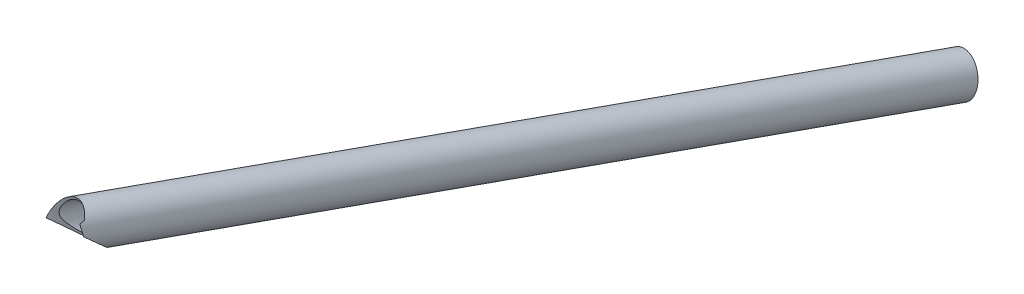
ISO-10303-21;
HEADER;
FILE_DESCRIPTION(('STEP AP214'),'2;1');
FILE_NAME('part.step','',(''),(''),'','','');
FILE_SCHEMA(('AUTOMOTIVE_DESIGN { 1 0 10303 214 1 1 1 1 }'));
ENDSEC;
DATA;
#1=APPLICATION_CONTEXT('core data for automotive mechanical design processes');
#2=APPLICATION_PROTOCOL_DEFINITION('international standard','automotive_design',2000,#1);
#3=PRODUCT_CONTEXT('',#1,'mechanical');
#4=PRODUCT('Part','Part','',(#3));
#5=PRODUCT_RELATED_PRODUCT_CATEGORY('part','',(#4));
#6=PRODUCT_DEFINITION_FORMATION('','',#4);
#7=PRODUCT_DEFINITION_CONTEXT('part definition',#1,'design');
#8=PRODUCT_DEFINITION('design','',#6,#7);
#9=PRODUCT_DEFINITION_SHAPE('','',#8);
#10=(LENGTH_UNIT() NAMED_UNIT(*) SI_UNIT(.MILLI.,.METRE.));
#11=(NAMED_UNIT(*) PLANE_ANGLE_UNIT() SI_UNIT($,.RADIAN.));
#12=(NAMED_UNIT(*) SI_UNIT($,.STERADIAN.) SOLID_ANGLE_UNIT());
#13=UNCERTAINTY_MEASURE_WITH_UNIT(LENGTH_MEASURE(1.E-05),#10,'distance_accuracy_value','');
#14=(GEOMETRIC_REPRESENTATION_CONTEXT(3) GLOBAL_UNCERTAINTY_ASSIGNED_CONTEXT((#13)) GLOBAL_UNIT_ASSIGNED_CONTEXT((#10,
#11,#12)) REPRESENTATION_CONTEXT('',''));
#15=CARTESIAN_POINT('',(0.,0.,0.));
#16=DIRECTION('',(0.,0.,1.));
#17=DIRECTION('',(1.,0.,0.));
#18=AXIS2_PLACEMENT_3D('',#15,#16,#17);
#19=CARTESIAN_POINT('',(-325.,320.000000000001,-1580.));
#20=DIRECTION('',(0.171152156864514,-0.228202875819352,-0.958452078441276));
#21=DIRECTION('',(0.,0.972806214685367,-0.23162052730604));
#22=AXIS2_PLACEMENT_3D('',#19,#20,#21);
#23=CYLINDRICAL_SURFACE('',#22,9.79999999999998);
#24=CARTESIAN_POINT('',(-250.,220.,-2000.));
#25=DIRECTION('',(-0.171152156864514,0.228202875819352,0.958452078441277));
#26=DIRECTION('',(-0.166932001795752,-0.965457944067909,0.200061653028832));
#27=AXIS2_PLACEMENT_3D('',#24,#25,#26);
#28=CIRCLE('',#27,9.79999999999998);
#29=CARTESIAN_POINT('',(-251.635933617598,210.538512148135,-1998.03939580032));
#30=VERTEX_POINT('',#29);
#31=EDGE_CURVE('E85',#30,#30,#28,.T.);
#32=ORIENTED_EDGE('',*,*,#31,.F.);
#33=EDGE_LOOP('',(#32));
#34=FACE_BOUND('',#33,.T.);
#35=CARTESIAN_POINT('',(-323.883441923824,328.044756802349,-1588.52260639419));
#36=CARTESIAN_POINT('',(-324.136487424916,328.031201247985,-1588.5795391723));
#37=CARTESIAN_POINT('',(-324.390409071568,328.008496905392,-1588.63041961915));
#38=CARTESIAN_POINT('',(-324.898284051821,327.944902518218,-1588.71956619623));
#39=CARTESIAN_POINT('',(-325.152237365107,327.904006074404,-1588.75782787943));
#40=CARTESIAN_POINT('',(-325.658589000445,327.804245335822,-1588.82143933747));
#41=CARTESIAN_POINT('',(-325.910984738547,327.74535668479,-1588.84677148453));
#42=CARTESIAN_POINT('',(-326.412007953383,327.610085815984,-1588.88434265663));
#43=CARTESIAN_POINT('',(-326.660635757793,327.533705128809,-1588.89658282674));
#44=CARTESIAN_POINT('',(-327.15198711971,327.364168753427,-1588.90808346139));
#45=CARTESIAN_POINT('',(-327.394718989368,327.27103844967,-1588.90736340609));
#46=CARTESIAN_POINT('',(-327.872977560984,327.068632735063,-1588.89332264943));
#47=CARTESIAN_POINT('',(-328.108504115194,326.959356993412,-1588.88000168987));
#48=CARTESIAN_POINT('',(-328.570661566778,326.72550908499,-1588.84130566927));
#49=CARTESIAN_POINT('',(-328.797296576491,326.600944102225,-1588.81593625353));
#50=CARTESIAN_POINT('',(-329.24034372592,326.337313640095,-1588.753881074));
#51=CARTESIAN_POINT('',(-329.456755746773,326.198247992192,-1588.71719517866));
#52=CARTESIAN_POINT('',(-329.882853776664,325.90312491773,-1588.63247874897));
#53=CARTESIAN_POINT('',(-330.09227355424,325.746752127553,-1588.58420840697));
#54=CARTESIAN_POINT('',(-330.497772441567,325.420573490696,-1588.47800758243));
#55=CARTESIAN_POINT('',(-330.6938511729,325.250767263272,-1588.42007682603));
#56=CARTESIAN_POINT('',(-331.071803312876,324.898211505746,-1588.29590245971));
#57=CARTESIAN_POINT('',(-331.25365312381,324.715441394271,-1588.22964549641));
#58=CARTESIAN_POINT('',(-331.60167809506,324.337857418278,-1588.09064114584));
#59=CARTESIAN_POINT('',(-331.767853441172,324.143043696564,-1588.01789383551));
#60=CARTESIAN_POINT('',(-332.094330709366,323.727991591758,-1587.86284974309));
#61=CARTESIAN_POINT('',(-332.253435597495,323.506926445993,-1587.78024040772));
#62=CARTESIAN_POINT('',(-332.551084227081,323.051829557808,-1587.61325372774));
#63=CARTESIAN_POINT('',(-332.689620238547,322.817792985742,-1587.52887573197));
#64=CARTESIAN_POINT('',(-332.944091817133,322.337478767063,-1587.3628593851));
#65=CARTESIAN_POINT('',(-333.060075523119,322.091228633975,-1587.28121551346));
#66=CARTESIAN_POINT('',(-333.267650840882,321.586210845975,-1587.12626610256));
#67=CARTESIAN_POINT('',(-333.359265930934,321.327455525543,-1587.05295257661));
#68=CARTESIAN_POINT('',(-333.480236909948,320.917873893446,-1586.95193891518));
#69=CARTESIAN_POINT('',(-333.519008012329,320.771181158797,-1586.91860842906));
#70=CARTESIAN_POINT('',(-333.588046824918,320.474544934014,-1586.85830864623));
#71=CARTESIAN_POINT('',(-333.618317857304,320.324602738655,-1586.83133686495));
#72=CARTESIAN_POINT('',(-333.669889198443,320.022350107985,-1586.7854208945));
#73=CARTESIAN_POINT('',(-333.691212396145,319.870046761559,-1586.76645622203));
#74=CARTESIAN_POINT('',(-333.724706884294,319.563530912209,-1586.73803207016));
#75=CARTESIAN_POINT('',(-333.736878379721,319.409318452123,-1586.72857237788));
#76=CARTESIAN_POINT('',(-333.752068506453,319.09867507167,-1586.7204347538));
#77=CARTESIAN_POINT('',(-333.754999601595,318.94223695505,-1586.72185950145));
#78=CARTESIAN_POINT('',(-333.751713366108,318.630019523956,-1586.7365522151));
#79=CARTESIAN_POINT('',(-333.745496618836,318.474240168108,-1586.74981942588));
#80=CARTESIAN_POINT('',(-333.724509060171,318.164644152213,-1586.78831350264));
#81=CARTESIAN_POINT('',(-333.709731917313,318.010829031113,-1586.81354921828));
#82=CARTESIAN_POINT('',(-333.672491821484,317.706456726946,-1586.87537954769));
#83=CARTESIAN_POINT('',(-333.650027481677,317.55590013696,-1586.91197621095));
#84=CARTESIAN_POINT('',(-333.591285737306,317.21786349651,-1587.00694062745));
#85=CARTESIAN_POINT('',(-333.552907325622,317.031656306668,-1587.06852924151));
#86=CARTESIAN_POINT('',(-333.467263173205,316.666553307002,-1587.20555182981));
#87=CARTESIAN_POINT('',(-333.41999353364,316.48766074672,-1587.28099187762));
#88=CARTESIAN_POINT('',(-333.318063376991,316.136489972063,-1587.44316004395));
#89=CARTESIAN_POINT('',(-333.263376944922,315.964237798638,-1587.52992770058));
#90=CARTESIAN_POINT('',(-333.148024186392,315.626518447809,-1587.71207394946));
#91=CARTESIAN_POINT('',(-333.087358665352,315.461050360785,-1587.80745138179));
#92=CARTESIAN_POINT('',(-332.935638354041,315.071079666909,-1588.04437958839));
#93=CARTESIAN_POINT('',(-332.842143774373,314.849476263317,-1588.18912364404));
#94=CARTESIAN_POINT('',(-332.646799640272,314.416174372458,-1588.48761862304));
#95=CARTESIAN_POINT('',(-332.544945821177,314.204481028616,-1588.64137413222));
#96=CARTESIAN_POINT('',(-332.33363801113,313.78915998528,-1588.9553073224));
#97=CARTESIAN_POINT('',(-332.224170433833,313.585547778255,-1589.11549625656));
#98=CARTESIAN_POINT('',(-331.998330787598,313.185642740891,-1589.43996114847));
#99=CARTESIAN_POINT('',(-331.88195999917,312.989348564027,-1589.60423634499));
#100=CARTESIAN_POINT('',(-331.641678918508,312.601784671402,-1589.93658053047));
#101=CARTESIAN_POINT('',(-331.517720798063,312.410560742379,-1590.10466821485));
#102=CARTESIAN_POINT('',(-331.263080366848,312.033972356369,-1590.44231616443));
#103=CARTESIAN_POINT('',(-331.132397804861,311.848608118713,-1590.61187648445));
#104=CARTESIAN_POINT('',(-330.864396960838,311.483544854982,-1590.95131445225));
#105=CARTESIAN_POINT('',(-330.727086355483,311.303839655244,-1591.12119152378));
#106=CARTESIAN_POINT('',(-330.445527313685,310.949649590846,-1591.46063809147));
#107=CARTESIAN_POINT('',(-330.301278881109,310.775164723277,-1591.6302075878));
#108=CARTESIAN_POINT('',(-329.994441466824,310.418373440365,-1591.98105324711));
#109=CARTESIAN_POINT('',(-329.831289772501,310.236469738616,-1592.16224770017));
#110=CARTESIAN_POINT('',(-329.496260357833,309.878704980509,-1592.5225472622));
#111=CARTESIAN_POINT('',(-329.324382415385,309.702844078147,-1592.70165231784));
#112=CARTESIAN_POINT('',(-328.97117064182,309.357236113556,-1593.05708663549));
#113=CARTESIAN_POINT('',(-328.789825170164,309.187497033232,-1593.23341211601));
#114=CARTESIAN_POINT('',(-328.41726923453,308.854862413558,-1593.58205702632));
#115=CARTESIAN_POINT('',(-328.226059197368,308.691966578668,-1593.75437662897));
#116=CARTESIAN_POINT('',(-327.835065733601,308.375373738525,-1594.09213163101));
#117=CARTESIAN_POINT('',(-327.635390717592,308.221599351425,-1594.25761960807));
#118=CARTESIAN_POINT('',(-327.224818113346,307.922412509549,-1594.58226957127));
#119=CARTESIAN_POINT('',(-327.013918585252,307.777001509255,-1594.74143045559));
#120=CARTESIAN_POINT('',(-326.58051044786,307.49622029538,-1595.05140986329));
#121=CARTESIAN_POINT('',(-326.358028094369,307.360828924686,-1595.20224578349));
#122=CARTESIAN_POINT('',(-325.900182622219,307.101585222075,-1595.49380900593));
#123=CARTESIAN_POINT('',(-325.664826853047,306.9777264131,-1595.63454197203));
#124=CARTESIAN_POINT('',(-325.278220302075,306.791172859995,-1595.84893028793));
#125=CARTESIAN_POINT('',(-325.131412208969,306.723986242878,-1595.9267119234));
#126=CARTESIAN_POINT('',(-324.832731935688,306.595197426143,-1596.07702574252));
#127=CARTESIAN_POINT('',(-324.680859906486,306.533595060243,-1596.14955808248));
#128=CARTESIAN_POINT('',(-324.371733071131,306.416646764159,-1596.28864047686));
#129=CARTESIAN_POINT('',(-324.214471322676,306.361309330899,-1596.35518238221));
#130=CARTESIAN_POINT('',(-323.894862027018,306.257887908045,-1596.48117743639));
#131=CARTESIAN_POINT('',(-323.732514389411,306.209804047476,-1596.54063045914));
#132=CARTESIAN_POINT('',(-323.234170243063,306.076951955321,-1596.7079499114));
#133=CARTESIAN_POINT('',(-322.890048434172,306.004827215257,-1596.80330143566));
#134=CARTESIAN_POINT('',(-322.362829174377,305.929270634161,-1596.91301220119));
#135=CARTESIAN_POINT('',(-322.185352390326,305.909525468315,-1596.94402165143));
#136=CARTESIAN_POINT('',(-321.827711643184,305.882048329118,-1596.99364153208));
#137=CARTESIAN_POINT('',(-321.647548704172,305.874311890068,-1597.01225657014));
#138=CARTESIAN_POINT('',(-321.329705327978,305.872169648059,-1597.03303475538));
#139=CARTESIAN_POINT('',(-321.192222498519,305.875006615074,-1597.03807686116));
#140=CARTESIAN_POINT('',(-320.917593176163,305.888513429916,-1597.03991702142));
#141=CARTESIAN_POINT('',(-320.78044661922,305.899181647361,-1597.03671679152));
#142=CARTESIAN_POINT('',(-320.507536106171,305.928501559483,-1597.0218445481));
#143=CARTESIAN_POINT('',(-320.371771506445,305.94714934562,-1597.01017668025));
#144=CARTESIAN_POINT('',(-320.102575749074,305.99239355235,-1596.97834653674));
#145=CARTESIAN_POINT('',(-319.969144668132,306.018990233704,-1596.95818398241));
#146=CARTESIAN_POINT('',(-319.705712451002,306.079875398939,-1596.90957159761));
#147=CARTESIAN_POINT('',(-319.575708578318,306.114157524748,-1596.88112861167));
#148=CARTESIAN_POINT('',(-319.319833924915,306.19003113557,-1596.81632230374));
#149=CARTESIAN_POINT('',(-319.193964596852,306.231625157669,-1596.77995623153));
#150=CARTESIAN_POINT('',(-318.947040730668,306.321592943407,-1596.69983088423));
#151=CARTESIAN_POINT('',(-318.825988322931,306.369969664979,-1596.65606838183));
#152=CARTESIAN_POINT('',(-318.589229961654,306.472870134116,-1596.5617978415));
#153=CARTESIAN_POINT('',(-318.473525336614,306.527395397658,-1596.51128813941));
#154=CARTESIAN_POINT('',(-318.207700076052,306.662275454472,-1596.38519680641));
#155=CARTESIAN_POINT('',(-318.059939855942,306.744929149551,-1596.30707931771));
#156=CARTESIAN_POINT('',(-317.775097837794,306.918717809731,-1596.14143104499));
#157=CARTESIAN_POINT('',(-317.638020454229,307.009856247203,-1596.05389640471));
#158=CARTESIAN_POINT('',(-317.242216879117,307.294086248464,-1595.7792839629));
#159=CARTESIAN_POINT('',(-316.99922843367,307.49782958574,-1595.58035083259));
#160=CARTESIAN_POINT('',(-316.594192642882,307.883745697752,-1595.20120981155));
#161=CARTESIAN_POINT('',(-316.42552639497,308.062721591716,-1595.02456466439));
#162=CARTESIAN_POINT('',(-316.110532640076,308.430009530018,-1594.66107544261));
#163=CARTESIAN_POINT('',(-315.964220076009,308.618327709018,-1594.47422465804));
#164=CARTESIAN_POINT('',(-315.691278930516,309.002212733694,-1594.09289822384));
#165=CARTESIAN_POINT('',(-315.564692321897,309.197793968289,-1593.89840738897));
#166=CARTESIAN_POINT('',(-315.329226113652,309.594315830594,-1593.50414095961));
#167=CARTESIAN_POINT('',(-315.220353296957,309.795258477165,-1593.30436337462));
#168=CARTESIAN_POINT('',(-315.022847766759,310.192472096435,-1592.9099305793));
#169=CARTESIAN_POINT('',(-314.933539932343,310.388565229802,-1592.71543136278));
#170=CARTESIAN_POINT('',(-314.768011811684,310.783885168073,-1592.32415625387));
#171=CARTESIAN_POINT('',(-314.691789638934,310.983111516746,-1592.12738069402));
#172=CARTESIAN_POINT('',(-314.551172460129,311.384472817302,-1591.73219231344));
#173=CARTESIAN_POINT('',(-314.486788866264,311.586610375276,-1591.53377810357));
#174=CARTESIAN_POINT('',(-314.368957264471,311.99333848937,-1591.13622375696));
#175=CARTESIAN_POINT('',(-314.315509567338,312.19792911503,-1590.93708359976));
#176=CARTESIAN_POINT('',(-314.218737481162,312.609448832867,-1590.53871623161));
#177=CARTESIAN_POINT('',(-314.175414438738,312.816378232277,-1590.3394890126));
#178=CARTESIAN_POINT('',(-314.09824011703,313.232539876621,-1589.94160385481));
#179=CARTESIAN_POINT('',(-314.064389080565,313.441772180447,-1589.74294593075));
#180=CARTESIAN_POINT('',(-314.005649535105,313.86251913516,-1589.34696895189));
#181=CARTESIAN_POINT('',(-313.980756014832,314.074032441507,-1589.14964920926));
#182=CARTESIAN_POINT('',(-313.939503832591,314.499668941221,-1588.75696689966));
#183=CARTESIAN_POINT('',(-313.923144728796,314.713791998894,-1588.5616042319));
#184=CARTESIAN_POINT('',(-313.897600137832,315.164019562962,-1588.1565717768));
#185=CARTESIAN_POINT('',(-313.889173798568,315.400398414502,-1587.94715821977));
#186=CARTESIAN_POINT('',(-313.881907141474,315.87736873625,-1587.53298642975));
#187=CARTESIAN_POINT('',(-313.883067062342,316.117960311204,-1587.32822831282));
#188=CARTESIAN_POINT('',(-313.895015620176,316.604407254886,-1586.92512296859));
#189=CARTESIAN_POINT('',(-313.905808108097,316.850264690454,-1586.72677833817));
#190=CARTESIAN_POINT('',(-313.937353342754,317.348424292278,-1586.33917391053));
#191=CARTESIAN_POINT('',(-313.958104340222,317.600725319317,-1586.14991252422));
#192=CARTESIAN_POINT('',(-314.004102356253,318.052410715809,-1585.82782097265));
#193=CARTESIAN_POINT('',(-314.027101675577,318.250087499467,-1585.69228591625));
#194=CARTESIAN_POINT('',(-314.079896887834,318.651108298088,-1585.43107135156));
#195=CARTESIAN_POINT('',(-314.109694471414,318.854453711711,-1585.30539430532));
#196=CARTESIAN_POINT('',(-314.176819348103,319.267057312659,-1585.06752281621));
#197=CARTESIAN_POINT('',(-314.214127206358,319.476299063661,-1584.9552947425));
#198=CARTESIAN_POINT('',(-314.297435739794,319.901614729847,-1584.74837330788));
#199=CARTESIAN_POINT('',(-314.343429634221,320.117683206914,-1584.6536663825));
#200=CARTESIAN_POINT('',(-314.426264776814,320.473559296172,-1584.51852129223));
#201=CARTESIAN_POINT('',(-314.460025361644,320.611427531282,-1584.47108047702));
#202=CARTESIAN_POINT('',(-314.531815016291,320.889170397782,-1584.38647555235));
#203=CARTESIAN_POINT('',(-314.569842386544,321.029044211075,-1584.34930737134));
#204=CARTESIAN_POINT('',(-314.650409014694,321.309779904004,-1584.28654386206));
#205=CARTESIAN_POINT('',(-314.692938682162,321.450639109459,-1584.26092452238));
#206=CARTESIAN_POINT('',(-314.782812595821,321.732541804519,-1584.22203725142));
#207=CARTESIAN_POINT('',(-314.830156680216,321.873585287774,-1584.20876890523));
#208=CARTESIAN_POINT('',(-314.929988545159,322.155130282317,-1584.19488364295));
#209=CARTESIAN_POINT('',(-314.982496711354,322.295627167535,-1584.19431906861));
#210=CARTESIAN_POINT('',(-315.09249601049,322.574137188472,-1584.20563424331));
#211=CARTESIAN_POINT('',(-315.149987251851,322.712150270072,-1584.21751426317));
#212=CARTESIAN_POINT('',(-315.269990018283,322.98479107685,-1584.25280986919));
#213=CARTESIAN_POINT('',(-315.332511667399,323.119411220834,-1584.2762492312));
#214=CARTESIAN_POINT('',(-315.462354189849,323.384115750995,-1584.33332236305));
#215=CARTESIAN_POINT('',(-315.529676663387,323.51419860309,-1584.36695954429));
#216=CARTESIAN_POINT('',(-315.694434356957,323.815825713313,-1584.4567752792));
#217=CARTESIAN_POINT('',(-315.793885503184,323.985155704127,-1584.51669946264));
#218=CARTESIAN_POINT('',(-316.001176805577,324.313541290125,-1584.64887815872));
#219=CARTESIAN_POINT('',(-316.109020411091,324.472592611033,-1584.72113775601));
#220=CARTESIAN_POINT('',(-316.333088437595,324.780571315416,-1584.87479655426));
#221=CARTESIAN_POINT('',(-316.449330223532,324.929476409097,-1584.95621489818));
#222=CARTESIAN_POINT('',(-316.689797459588,325.216867912723,-1585.12529944824));
#223=CARTESIAN_POINT('',(-316.814022855042,325.355354393991,-1585.21296561159));
#224=CARTESIAN_POINT('',(-317.117864083785,325.671564112156,-1585.42558290562));
#225=CARTESIAN_POINT('',(-317.300936488655,325.844791794829,-1585.55230424583));
#226=CARTESIAN_POINT('',(-317.681396544999,326.172284871511,-1585.80879479392));
#227=CARTESIAN_POINT('',(-317.87878854916,326.326544461121,-1585.93856492037));
#228=CARTESIAN_POINT('',(-318.287319221113,326.616118893955,-1586.19768881414));
#229=CARTESIAN_POINT('',(-318.498459752829,326.751431160577,-1586.3270425225));
#230=CARTESIAN_POINT('',(-318.933694096002,327.002870198641,-1586.58248846375));
#231=CARTESIAN_POINT('',(-319.157786269065,327.118999389622,-1586.70858110627));
#232=CARTESIAN_POINT('',(-319.619682105425,327.332500596287,-1586.95606087085));
#233=CARTESIAN_POINT('',(-319.857573455318,327.429730406763,-1587.07740721445));
#234=CARTESIAN_POINT('',(-320.344413851322,327.603908137228,-1587.31234651757));
#235=CARTESIAN_POINT('',(-320.593364379901,327.68085332845,-1587.42593843241));
#236=CARTESIAN_POINT('',(-321.10032804855,327.813796976985,-1587.6432920115));
#237=CARTESIAN_POINT('',(-321.358321378931,327.869838430314,-1587.74707352221));
#238=CARTESIAN_POINT('',(-321.882070348571,327.960708594615,-1587.94342691721));
#239=CARTESIAN_POINT('',(-322.147822248412,327.995547353433,-1588.03600409449));
#240=CARTESIAN_POINT('',(-322.657244917225,328.041178862098,-1588.19961950513));
#241=CARTESIAN_POINT('',(-322.900329457717,328.054099767553,-1588.27189703739));
#242=CARTESIAN_POINT('',(-323.389810928438,328.062511872007,-1588.40557853499));
#243=CARTESIAN_POINT('',(-323.636208245137,328.058001019525,-1588.46698121962));
#244=CARTESIAN_POINT('',(-323.883441923824,328.044756802349,-1588.52260639419));
#245=B_SPLINE_CURVE_WITH_KNOTS('',3,(#35,#36,#37,#38,#39,#40,#41,#42,#43,#44,#45,#46,#47,#48,
#49,#50,#51,#52,#53,#54,#55,#56,#57,#58,#59,#60,#61,#62,#63,#64,#65,#66,#67,#68,#69,#70,#71,#72,
#73,#74,#75,#76,#77,#78,#79,#80,#81,#82,#83,#84,#85,#86,#87,#88,#89,#90,#91,#92,#93,#94,#95,#96,
#97,#98,#99,#100,#101,#102,#103,#104,#105,#106,#107,#108,#109,#110,#111,#112,#113,#114,#115,
#116,#117,#118,#119,#120,#121,#122,#123,#124,#125,#126,#127,#128,#129,#130,#131,#132,#133,#134,
#135,#136,#137,#138,#139,#140,#141,#142,#143,#144,#145,#146,#147,#148,#149,#150,#151,#152,#153,
#154,#155,#156,#157,#158,#159,#160,#161,#162,#163,#164,#165,#166,#167,#168,#169,#170,#171,#172,
#173,#174,#175,#176,#177,#178,#179,#180,#181,#182,#183,#184,#185,#186,#187,#188,#189,#190,#191,
#192,#193,#194,#195,#196,#197,#198,#199,#200,#201,#202,#203,#204,#205,#206,#207,#208,#209,#210,
#211,#212,#213,#214,#215,#216,#217,#218,#219,#220,#221,#222,#223,#224,#225,#226,#227,#228,#229,
#230,#231,#232,#233,#234,#235,#236,#237,#238,#239,#240,#241,#242,#243,#244),.UNSPECIFIED.,.T.,
.F.,(4,2,2,2,2,2,2,2,2,2,2,2,2,2,2,2,2,2,2,2,2,2,2,2,2,2,2,2,2,2,2,2,2,2,2,2,2,2,2,2,2,2,2,2,2,
2,2,2,2,2,2,2,2,2,2,2,2,2,2,2,2,2,2,2,2,2,2,2,2,2,2,2,2,2,2,2,2,2,2,2,2,2,2,2,2,2,2,2,2,2,2,2,2,
2,2,2,2,2,2,2,2,2,2,2,4),(0.,0.778946805111406,1.55816782861835,2.33844840201982,
3.11866072495122,3.89770043103775,4.67675610090994,5.4554471047065,6.23414716016954,
7.03061934551481,7.82711411336219,8.62490298607427,9.4226824010494,10.2755254011069,
11.1286881012398,11.9800092006901,12.8305070875934,13.2962241875336,13.7617590119171,
14.2260956094426,14.6904218063914,15.1591336417943,15.627815588735,16.0968446268755,
16.5659583264198,17.1644959601618,17.7632966690693,18.3642463040277,18.9651150976007,
19.8066433352127,20.6486035993572,21.4921068793532,22.3354541800632,23.1848127514056,
24.0342030769317,24.8826321883742,25.7310608269436,26.6434831828897,27.555928773702,
28.4695239442306,29.3830796188461,30.2872388727134,31.1915548969378,32.0939034295695,
32.9957420781205,33.5331760518223,34.07059401707,34.6087323473417,35.1468802487622,
36.2342464892614,36.7773221592636,37.3201958266291,37.7325823977015,38.1448831385463,
38.556982157585,38.9690946969423,39.380867550723,39.7927835646433,40.2048797769466,
40.6170778182618,41.1755752768811,41.7343023131679,42.8528870189403,43.7601439463247,
44.6680047249023,45.5777716177143,46.4878860609878,47.3583520844786,48.2286925107346,
49.0998675815219,49.971067407305,50.8423830402311,51.7137210077676,52.5845707451495,
53.4553753940001,54.4029134579182,55.3504751154539,56.2984157636028,57.2461899617853,
57.9682471060479,58.6904840133979,59.4108754243826,60.1307067692035,60.5793268779329,
61.0277689207181,61.475274250046,61.9227645453578,62.3720982425744,62.821441718654,
63.2717133065592,63.7221356863426,64.3371085514619,64.9523355225366,65.5688731666658,
66.1854065897363,67.0305862666594,67.8760239355818,68.7215764622045,69.5670222587567,
70.4186021549954,71.2702965507731,72.1202293437619,72.9697590437539,73.7307258303123,
74.4917821751112),.UNSPECIFIED.);
#246=CARTESIAN_POINT('',(-323.883441923824,328.044756802349,-1588.52260639419));
#247=VERTEX_POINT('',#246);
#248=EDGE_CURVE('E92',#247,#247,#245,.T.);
#249=ORIENTED_EDGE('',*,*,#248,.T.);
#250=EDGE_LOOP('',(#249));
#251=FACE_BOUND('',#250,.T.);
#252=ADVANCED_FACE('F41',(#34,#251),#23,.F.);
#253=CARTESIAN_POINT('',(-325.,320.000000000001,-1580.));
#254=DIRECTION('',(0.171152156864514,-0.228202875819352,-0.958452078441276));
#255=DIRECTION('',(0.,0.972806214685367,-0.23162052730604));
#256=AXIS2_PLACEMENT_3D('',#253,#254,#255);
#257=CYLINDRICAL_SURFACE('',#256,11.);
#258=CARTESIAN_POINT('',(-250.,220.,-2000.));
#259=DIRECTION('',(-0.171152156864514,0.228202875819352,0.958452078441277));
#260=DIRECTION('',(-0.166932001795752,-0.965457944067909,0.200061653028832));
#261=AXIS2_PLACEMENT_3D('',#258,#259,#260);
#262=CIRCLE('',#261,11.);
#263=CARTESIAN_POINT('',(-251.836252019753,209.379962615253,-1997.79932181668));
#264=VERTEX_POINT('',#263);
#265=EDGE_CURVE('E87',#264,#264,#262,.T.);
#266=ORIENTED_EDGE('',*,*,#265,.T.);
#267=EDGE_LOOP('',(#266));
#268=FACE_BOUND('',#267,.T.);
#269=CARTESIAN_POINT('',(-325.,320.,-1580.));
#270=DIRECTION('',(0.526991553913357,-0.846050959333568,-0.0804840127897105));
#271=DIRECTION('',(-0.020132316108703,0.0822472927426935,-0.996408587219418));
#272=AXIS2_PLACEMENT_3D('',#269,#270,#271);
#273=ELLIPSE('',#272,30.5210436776293,11.);
#274=CARTESIAN_POINT('',(-315.659557692804,325.81486052971,-1579.96687694731));
#275=VERTEX_POINT('',#274);
#276=CARTESIAN_POINT('',(-315.751220700313,326.001625780896,-1582.53034941331));
#277=VERTEX_POINT('',#276);
#278=EDGE_CURVE('E70',#275,#277,#273,.F.);
#279=ORIENTED_EDGE('',*,*,#278,.F.);
#280=CARTESIAN_POINT('',(-325.,320.000000000001,-1580.));
#281=DIRECTION('',(-0.0427126536783039,0.0629297921225689,0.997103540500768));
#282=DIRECTION('',(0.611440895819701,-0.787641342485716,0.0759022168747455));
#283=AXIS2_PLACEMENT_3D('',#280,#281,#282);
#284=ELLIPSE('',#283,11.2549576190536,11.);
#285=CARTESIAN_POINT('',(-314.891903689015,324.374891386588,-1579.84311297151));
#286=VERTEX_POINT('',#285);
#287=EDGE_CURVE('E46',#286,#275,#284,.T.);
#288=ORIENTED_EDGE('',*,*,#287,.F.);
#289=CARTESIAN_POINT('',(-325.,320.,-1580.));
#290=DIRECTION('',(-0.020132316108703,0.0822472927426935,-0.996408587219418));
#291=DIRECTION('',(0.526991553913357,-0.846050959333568,-0.0804840127897105));
#292=AXIS2_PLACEMENT_3D('',#289,#290,#291);
#293=ELLIPSE('',#292,11.7925144812184,11.);
#294=CARTESIAN_POINT('',(-313.841284703454,320.540121803661,-1580.18087683098));
#295=VERTEX_POINT('',#294);
#296=EDGE_CURVE('E73',#295,#286,#293,.F.);
#297=ORIENTED_EDGE('',*,*,#296,.F.);
#298=CARTESIAN_POINT('',(-325.,320.000000000001,-1580.));
#299=DIRECTION('',(-0.046806891515563,0.743683273485426,-0.666891523146495));
#300=DIRECTION('',(0.217268286027578,-0.644059979147453,-0.733472041148959));
#301=AXIS2_PLACEMENT_3D('',#298,#299,#300);
#302=ELLIPSE('',#301,23.8372924851441,11.);
#303=CARTESIAN_POINT('',(-335.724879319694,318.028514830939,-1581.44575579064));
#304=VERTEX_POINT('',#303);
#305=EDGE_CURVE('E51',#304,#295,#302,.F.);
#306=ORIENTED_EDGE('',*,*,#305,.F.);
#307=CARTESIAN_POINT('',(-325.,320.000000000001,-1580.));
#308=DIRECTION('',(0.217268286027578,-0.644059979147453,-0.733472041148959));
#309=DIRECTION('',(-0.046806891515563,0.743683273485426,-0.666891523146495));
#310=AXIS2_PLACEMENT_3D('',#307,#308,#309);
#311=ELLIPSE('',#310,12.3991151975754,11.);
#312=EDGE_CURVE('E61',#277,#304,#311,.F.);
#313=ORIENTED_EDGE('',*,*,#312,.F.);
#314=EDGE_LOOP('',(#279,#288,#297,#306,#313));
#315=FACE_BOUND('',#314,.T.);
#316=ADVANCED_FACE('F84',(#268,#315),#257,.T.);
#317=CARTESIAN_POINT('',(-250.,220.,-2000.));
#318=DIRECTION('',(-0.171152156864514,0.228202875819352,0.958452078441277));
#319=DIRECTION('',(-0.166932001795752,-0.965457944067909,0.200061653028832));
#320=AXIS2_PLACEMENT_3D('',#317,#318,#319);
#321=PLANE('',#320);
#322=ORIENTED_EDGE('',*,*,#31,.T.);
#323=EDGE_LOOP('',(#322));
#324=FACE_BOUND('',#323,.T.);
#325=ORIENTED_EDGE('',*,*,#265,.F.);
#326=EDGE_LOOP('',(#325));
#327=FACE_BOUND('',#326,.T.);
#328=ADVANCED_FACE('F106',(#324,#327),#321,.F.);
#329=CARTESIAN_POINT('',(-325.,320.,-1580.));
#330=DIRECTION('',(-0.0427126536783039,0.0629297921225689,0.997103540500768));
#331=DIRECTION('',(0.,-0.998014330188054,0.0629872744234134));
#332=AXIS2_PLACEMENT_3D('',#329,#330,#331);
#333=PLANE('',#332);
#334=ORIENTED_EDGE('',*,*,#287,.T.);
#335=CARTESIAN_POINT('',(-325.,320.,-1580.));
#336=DIRECTION('',(-0.0427126536783039,0.0629297921225689,0.997103540500768));
#337=DIRECTION('',(0.489400664257567,-0.868759037548238,0.0757939608577898));
#338=AXIS2_PLACEMENT_3D('',#335,#336,#337);
#339=ELLIPSE('',#338,12.7182524712078,11.);
#340=EDGE_CURVE('E76',#275,#286,#339,.F.);
#341=ORIENTED_EDGE('',*,*,#340,.T.);
#342=EDGE_LOOP('',(#334,#341));
#343=FACE_BOUND('',#342,.T.);
#344=ADVANCED_FACE('F82',(#343),#333,.T.);
#345=CARTESIAN_POINT('',(-325.,320.,-1580.));
#346=DIRECTION('',(0.208710809439999,-0.381642622975999,0.900438063583998));
#347=DIRECTION('',(0.,-0.920714591276893,-0.390236647958419));
#348=AXIS2_PLACEMENT_3D('',#345,#346,#347);
#349=CYLINDRICAL_SURFACE('',#348,11.);
#350=ORIENTED_EDGE('',*,*,#278,.T.);
#351=CARTESIAN_POINT('',(-325.,320.,-1580.));
#352=DIRECTION('',(-0.00416950723616265,0.393939167319852,0.919127057408686));
#353=DIRECTION('',(-0.2871987901008,0.87994037819309,-0.37844654284329));
#354=AXIS2_PLACEMENT_3D('',#351,#352,#353);
#355=ELLIPSE('',#354,16.2624994633842,11.);
#356=EDGE_CURVE('E11',#295,#277,#355,.T.);
#357=ORIENTED_EDGE('',*,*,#356,.F.);
#358=ORIENTED_EDGE('',*,*,#296,.T.);
#359=ORIENTED_EDGE('',*,*,#340,.F.);
#360=EDGE_LOOP('',(#350,#357,#358,#359));
#361=FACE_BOUND('',#360,.T.);
#362=ADVANCED_FACE('F75',(#361),#349,.F.);
#363=CARTESIAN_POINT('',(-250.,0.,-1700.));
#364=DIRECTION('',(-0.214351342090107,0.914565726251124,0.342962147344171));
#365=DIRECTION('',(0.,-0.351123441588391,0.936329177569045));
#366=AXIS2_PLACEMENT_3D('',#363,#364,#365);
#367=CYLINDRICAL_SURFACE('',#366,11.);
#368=ORIENTED_EDGE('',*,*,#248,.F.);
#369=EDGE_LOOP('',(#368));
#370=FACE_BOUND('',#369,.T.);
#371=ORIENTED_EDGE('',*,*,#312,.T.);
#372=ORIENTED_EDGE('',*,*,#305,.T.);
#373=ORIENTED_EDGE('',*,*,#356,.T.);
#374=EDGE_LOOP('',(#371,#372,#373));
#375=FACE_BOUND('',#374,.T.);
#376=ADVANCED_FACE('F43',(#370,#375),#367,.F.);
#377=CLOSED_SHELL('',(#252,#316,#328,#344,#362,#376));
#378=MANIFOLD_SOLID_BREP('B2',#377);
#379=ADVANCED_BREP_SHAPE_REPRESENTATION('',(#18,#378),#14);
#380=SHAPE_DEFINITION_REPRESENTATION(#9,#379);
ENDSEC;
END-ISO-10303-21;
